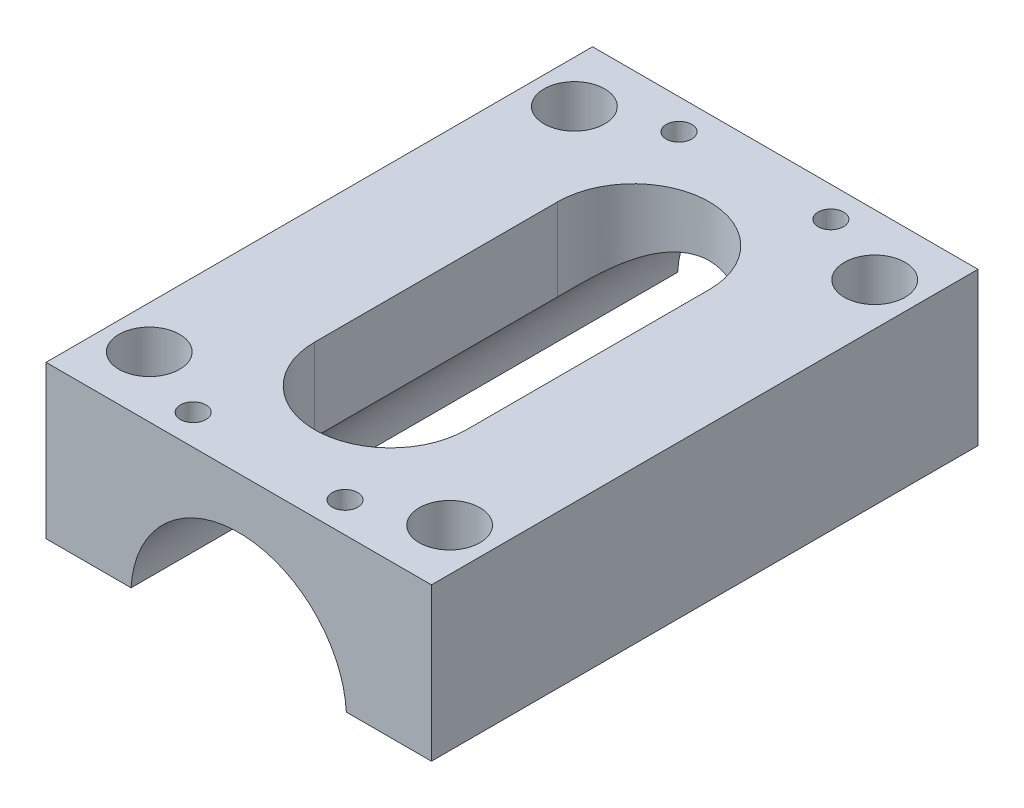
ISO-10303-21;
HEADER;
FILE_DESCRIPTION(('STEP AP214'),'2;1');
FILE_NAME('part.step','',(''),(''),'','','');
FILE_SCHEMA(('AUTOMOTIVE_DESIGN { 1 0 10303 214 1 1 1 1 }'));
ENDSEC;
DATA;
#1=APPLICATION_CONTEXT('core data for automotive mechanical design processes');
#2=APPLICATION_PROTOCOL_DEFINITION('international standard','automotive_design',2000,#1);
#3=PRODUCT_CONTEXT('',#1,'mechanical');
#4=PRODUCT('Part','Part','',(#3));
#5=PRODUCT_RELATED_PRODUCT_CATEGORY('part','',(#4));
#6=PRODUCT_DEFINITION_FORMATION('','',#4);
#7=PRODUCT_DEFINITION_CONTEXT('part definition',#1,'design');
#8=PRODUCT_DEFINITION('design','',#6,#7);
#9=PRODUCT_DEFINITION_SHAPE('','',#8);
#10=(LENGTH_UNIT() NAMED_UNIT(*) SI_UNIT(.MILLI.,.METRE.));
#11=(NAMED_UNIT(*) PLANE_ANGLE_UNIT() SI_UNIT($,.RADIAN.));
#12=(NAMED_UNIT(*) SI_UNIT($,.STERADIAN.) SOLID_ANGLE_UNIT());
#13=UNCERTAINTY_MEASURE_WITH_UNIT(LENGTH_MEASURE(1.E-05),#10,'distance_accuracy_value','');
#14=(GEOMETRIC_REPRESENTATION_CONTEXT(3) GLOBAL_UNCERTAINTY_ASSIGNED_CONTEXT((#13)) GLOBAL_UNIT_ASSIGNED_CONTEXT((#10,
#11,#12)) REPRESENTATION_CONTEXT('',''));
#15=CARTESIAN_POINT('',(0.,0.,0.));
#16=DIRECTION('',(0.,0.,1.));
#17=DIRECTION('',(1.,0.,0.));
#18=AXIS2_PLACEMENT_3D('',#15,#16,#17);
#19=CARTESIAN_POINT('',(-31.734248061046,1.,90.));
#20=DIRECTION('',(0.,1.,0.));
#21=DIRECTION('',(0.,0.,1.));
#22=AXIS2_PLACEMENT_3D('',#19,#20,#21);
#23=PLANE('',#22);
#24=CARTESIAN_POINT('',(-24.7280283297466,1.,10.));
#25=DIRECTION('',(0.,-1.,0.));
#26=DIRECTION('',(0.,0.,-1.));
#27=AXIS2_PLACEMENT_3D('',#24,#25,#26);
#28=CIRCLE('',#27,2.5);
#29=CARTESIAN_POINT('',(-24.7280283297466,1.,7.5));
#30=VERTEX_POINT('',#29);
#31=EDGE_CURVE('E401',#30,#30,#28,.T.);
#32=ORIENTED_EDGE('',*,*,#31,.F.);
#33=EDGE_LOOP('',(#32));
#34=FACE_BOUND('',#33,.T.);
#35=DIRECTION('',(1.,0.,0.));
#36=VECTOR('',#35,1.);
#37=CARTESIAN_POINT('',(-31.734248061046,1.,0.));
#38=LINE('',#37,#36);
#39=CARTESIAN_POINT('',(-31.734248061046,1.,0.));
#40=VERTEX_POINT('',#39);
#41=CARTESIAN_POINT('',(-17.7218085984473,0.999999999999997,0.));
#42=VERTEX_POINT('',#41);
#43=EDGE_CURVE('E321',#40,#42,#38,.T.);
#44=ORIENTED_EDGE('',*,*,#43,.T.);
#45=DIRECTION('',(0.,0.,-1.));
#46=VECTOR('',#45,1.);
#47=CARTESIAN_POINT('',(-17.7218085984473,0.999999999999997,90.));
#48=LINE('',#47,#46);
#49=CARTESIAN_POINT('',(-17.7218085984473,0.999999999999997,90.));
#50=VERTEX_POINT('',#49);
#51=EDGE_CURVE('E67',#50,#42,#48,.T.);
#52=ORIENTED_EDGE('',*,*,#51,.F.);
#53=DIRECTION('',(1.,0.,0.));
#54=VECTOR('',#53,1.);
#55=CARTESIAN_POINT('',(-31.734248061046,1.,90.));
#56=LINE('',#55,#54);
#57=CARTESIAN_POINT('',(-31.734248061046,1.,90.));
#58=VERTEX_POINT('',#57);
#59=EDGE_CURVE('E334',#58,#50,#56,.T.);
#60=ORIENTED_EDGE('',*,*,#59,.F.);
#61=DIRECTION('',(0.,0.,-1.));
#62=VECTOR('',#61,1.);
#63=CARTESIAN_POINT('',(-31.734248061046,1.,90.));
#64=LINE('',#63,#62);
#65=EDGE_CURVE('E12',#58,#40,#64,.T.);
#66=ORIENTED_EDGE('',*,*,#65,.T.);
#67=EDGE_LOOP('',(#44,#52,#60,#66));
#68=FACE_BOUND('',#67,.T.);
#69=CARTESIAN_POINT('',(-24.7280283297466,1.,80.));
#70=DIRECTION('',(0.,-1.,0.));
#71=DIRECTION('',(0.,0.,-1.));
#72=AXIS2_PLACEMENT_3D('',#69,#70,#71);
#73=CIRCLE('',#72,2.5);
#74=CARTESIAN_POINT('',(-24.7280283297466,1.,77.5));
#75=VERTEX_POINT('',#74);
#76=EDGE_CURVE('E398',#75,#75,#73,.T.);
#77=ORIENTED_EDGE('',*,*,#76,.F.);
#78=EDGE_LOOP('',(#77));
#79=FACE_BOUND('',#78,.T.);
#80=ADVANCED_FACE('F59',(#34,#68,#79),#23,.F.);
#81=CARTESIAN_POINT('',(0.,0.,90.));
#82=DIRECTION('',(0.,0.,-1.));
#83=DIRECTION('',(-1.,0.,0.));
#84=AXIS2_PLACEMENT_3D('',#81,#82,#83);
#85=CYLINDRICAL_SURFACE('',#84,17.75);
#86=DIRECTION('',(0.,0.,-1.));
#87=VECTOR('',#86,1.);
#88=CARTESIAN_POINT('',(12.5,12.6020831611286,90.));
#89=LINE('',#88,#87);
#90=CARTESIAN_POINT('',(12.5,12.6020831611286,25.));
#91=VERTEX_POINT('',#90);
#92=CARTESIAN_POINT('',(12.5,12.6020831611286,65.));
#93=VERTEX_POINT('',#92);
#94=EDGE_CURVE('E308',#91,#93,#89,.F.);
#95=ORIENTED_EDGE('',*,*,#94,.F.);
#96=CARTESIAN_POINT('',(-12.5,12.6020831611286,25.));
#97=CARTESIAN_POINT('',(-12.5000028339154,12.6020746389274,24.8491115809428));
#98=CARTESIAN_POINT('',(-12.4972670789548,12.6047945701414,24.6982503162762));
#99=CARTESIAN_POINT('',(-12.4863537975247,12.61560764559,24.3969359446047));
#100=CARTESIAN_POINT('',(-12.4781769481296,12.6237001212803,24.2464827891545));
#101=CARTESIAN_POINT('',(-12.4455777232016,12.6558715266399,23.7967739301851));
#102=CARTESIAN_POINT('',(-12.4130863798533,12.687845066378,23.4985992286537));
#103=CARTESIAN_POINT('',(-12.3278081406473,12.7707122358189,22.9113941783297));
#104=CARTESIAN_POINT('',(-12.2752505457002,12.8213918971674,22.6222990632822));
#105=CARTESIAN_POINT('',(-12.1508323661772,12.9393626253403,22.0516823867227));
#106=CARTESIAN_POINT('',(-12.0789648031872,13.0066596968041,21.7701636037595));
#107=CARTESIAN_POINT('',(-11.9175751692122,13.1546871742176,21.2179841220977));
#108=CARTESIAN_POINT('',(-11.8281679456945,13.235329685367,20.9472658875278));
#109=CARTESIAN_POINT('',(-11.6324699793027,13.4076519080734,20.4156936382005));
#110=CARTESIAN_POINT('',(-11.5261803883721,13.4993308664714,20.1548389519208));
#111=CARTESIAN_POINT('',(-11.297277223378,13.6914724097666,19.6427209766633));
#112=CARTESIAN_POINT('',(-11.1746152333951,13.7919607306676,19.3914890946909));
#113=CARTESIAN_POINT('',(-10.9139559468112,13.9991353833763,18.8997525074028));
#114=CARTESIAN_POINT('',(-10.7759564707944,14.1058225949994,18.6592493334297));
#115=CARTESIAN_POINT('',(-10.4595829262789,14.3424266489918,18.1477888017447));
#116=CARTESIAN_POINT('',(-10.2783801926229,14.4731226505208,17.8789383942353));
#117=CARTESIAN_POINT('',(-9.89632526180166,14.7369999071883,17.3568731814093));
#118=CARTESIAN_POINT('',(-9.6954716249906,14.8701813438332,17.1036595238775));
#119=CARTESIAN_POINT('',(-9.27457705897201,15.1362721776798,16.6133047352128));
#120=CARTESIAN_POINT('',(-9.05452705291189,15.2691814154416,16.3761713027086));
#121=CARTESIAN_POINT('',(-8.59580050147127,15.5320513070787,15.9188594167782));
#122=CARTESIAN_POINT('',(-8.35712265640927,15.6620117543962,15.6986821485324));
#123=CARTESIAN_POINT('',(-7.81944416924676,15.9381610345998,15.2403171188236));
#124=CARTESIAN_POINT('',(-7.51708921162151,16.0833491208002,15.0054382504416));
#125=CARTESIAN_POINT('',(-6.88847960127637,16.3624454785038,14.5622445248512));
#126=CARTESIAN_POINT('',(-6.56222047227989,16.496351627215,14.353934663054));
#127=CARTESIAN_POINT('',(-5.88781200273158,16.7488990364195,13.9666582473138));
#128=CARTESIAN_POINT('',(-5.53969673358094,16.8675632190535,13.787647517002));
#129=CARTESIAN_POINT('',(-4.82335027303136,17.0861885160032,13.4613688366644));
#130=CARTESIAN_POINT('',(-4.45512808047134,17.1861579099442,13.3140868300767));
#131=CARTESIAN_POINT('',(-3.80414937844412,17.3398517622609,13.089387281807));
#132=CARTESIAN_POINT('',(-3.52538426931816,17.398759025145,13.0038627173074));
#133=CARTESIAN_POINT('',(-2.96031795243664,17.5037575992699,12.852076590409));
#134=CARTESIAN_POINT('',(-2.67401836890562,17.5498516483096,12.7858109128262));
#135=CARTESIAN_POINT('',(-2.0958166500395,17.6282477026815,12.6734337210887));
#136=CARTESIAN_POINT('',(-1.80391824106091,17.6605585699941,12.6273092565658));
#137=CARTESIAN_POINT('',(-1.2163392669975,17.7107298513297,12.5558004349258));
#138=CARTESIAN_POINT('',(-0.920658573225944,17.7285897723447,12.5304167854013));
#139=CARTESIAN_POINT('',(-0.327116712337425,17.749474678557,12.5007414876496));
#140=CARTESIAN_POINT('',(-0.0292523562579923,17.7524697614921,12.4964923537959));
#141=CARTESIAN_POINT('',(0.565789817364994,17.7434754654324,12.5092657582647));
#142=CARTESIAN_POINT('',(0.86296763748399,17.7314861427411,12.5262882166596));
#143=CARTESIAN_POINT('',(1.45446381947151,17.6927924171469,12.5813532878807));
#144=CARTESIAN_POINT('',(1.74878149483333,17.6660845660718,12.6194008263474));
#145=CARTESIAN_POINT('',(2.33238056332611,17.5985452527027,12.7159662703409));
#146=CARTESIAN_POINT('',(2.62166195544371,17.557713787567,12.7744841799867));
#147=CARTESIAN_POINT('',(3.186470442875,17.4639315909855,12.9095612517079));
#148=CARTESIAN_POINT('',(3.46216102768179,17.4112933381362,12.9856565352162));
#149=CARTESIAN_POINT('',(4.00542822540127,17.2943994333246,13.1556949123817));
#150=CARTESIAN_POINT('',(4.27300502310016,17.2301440461673,13.2496375992216));
#151=CARTESIAN_POINT('',(4.79877655155266,17.0911726398382,13.4543803636775));
#152=CARTESIAN_POINT('',(5.05697214008251,17.0164575800996,13.56517889524));
#153=CARTESIAN_POINT('',(5.56309622167352,16.8577826034256,13.8026725542841));
#154=CARTESIAN_POINT('',(5.81102095626205,16.7738193426545,13.9293734338401));
#155=CARTESIAN_POINT('',(6.3228101019385,16.5881495834104,14.2126508971003));
#156=CARTESIAN_POINT('',(6.58536356912699,16.4855087163775,14.370983687089));
#157=CARTESIAN_POINT('',(7.09600881246031,16.2722392188065,14.7048663949519));
#158=CARTESIAN_POINT('',(7.34409432645068,16.1616071751538,14.8804236811949));
#159=CARTESIAN_POINT('',(7.82532403288037,15.9341674181209,15.2477684808738));
#160=CARTESIAN_POINT('',(8.05845467773714,15.817354275314,15.4395703552987));
#161=CARTESIAN_POINT('',(8.50901164829316,15.5796051242141,15.8382754006691));
#162=CARTESIAN_POINT('',(8.726442319591,15.4586702705181,16.0451743607643));
#163=CARTESIAN_POINT('',(9.18311877665418,15.1925862405816,16.512046398157));
#164=CARTESIAN_POINT('',(9.4192192026366,15.0470061383688,16.7748588989846));
#165=CARTESIAN_POINT('',(9.86850887617469,14.756241093611,17.3196846294302));
#166=CARTESIAN_POINT('',(10.0816933711716,14.6110562390985,17.6017018221954));
#167=CARTESIAN_POINT('',(10.4843560811418,14.3248662435936,18.184304722987));
#168=CARTESIAN_POINT('',(10.673829344452,14.1838619803181,18.4848942900067));
#169=CARTESIAN_POINT('',(11.0278945964214,13.910357674617,19.1040147818757));
#170=CARTESIAN_POINT('',(11.1924943658501,13.7778549802782,19.422540053217));
#171=CARTESIAN_POINT('',(11.460621569738,13.5550621139153,20.0018663349969));
#172=CARTESIAN_POINT('',(11.5694984441117,13.4620594525255,20.2591557006044));
#173=CARTESIAN_POINT('',(11.7707616449666,13.2864406732411,20.783598128025));
#174=CARTESIAN_POINT('',(11.8631480648452,13.2038244965211,21.0507511339628));
#175=CARTESIAN_POINT('',(12.0301266066103,13.0518687043933,21.5932019188244));
#176=CARTESIAN_POINT('',(12.104779586803,12.9824838478283,21.8684680876994));
#177=CARTESIAN_POINT('',(12.2356065312731,12.8592576502227,22.4266564871443));
#178=CARTESIAN_POINT('',(12.2917882678387,12.8054097727376,22.7095754432164));
#179=CARTESIAN_POINT('',(12.391519912377,12.7089864737009,23.3235539848457));
#180=CARTESIAN_POINT('',(12.4320034477662,12.6692274830362,23.6555820959273));
#181=CARTESIAN_POINT('',(12.472697549302,12.6291185974622,24.1572765061852));
#182=CARTESIAN_POINT('',(12.4829239734786,12.6190033690316,24.3254481742661));
#183=CARTESIAN_POINT('',(12.4965785824733,12.6054778360731,24.6623996296319));
#184=CARTESIAN_POINT('',(12.5000041733327,12.6020700899026,24.8311796243635));
#185=CARTESIAN_POINT('',(12.5,12.6020831611286,25.));
#186=B_SPLINE_CURVE_WITH_KNOTS('',3,(#96,#97,#98,#99,#100,#101,#102,#103,#104,#105,#106,#107,
#108,#109,#110,#111,#112,#113,#114,#115,#116,#117,#118,#119,#120,#121,#122,#123,#124,#125,#126,
#127,#128,#129,#130,#131,#132,#133,#134,#135,#136,#137,#138,#139,#140,#141,#142,#143,#144,#145,
#146,#147,#148,#149,#150,#151,#152,#153,#154,#155,#156,#157,#158,#159,#160,#161,#162,#163,#164,
#165,#166,#167,#168,#169,#170,#171,#172,#173,#174,#175,#176,#177,#178,#179,#180,#181,#182,#183,
#184,#185),.UNSPECIFIED.,.F.,.F.,(4,2,2,2,2,2,2,2,2,2,2,2,2,2,2,2,2,2,2,2,2,2,2,2,2,2,2,2,2,2,2,
2,2,2,2,2,2,2,2,2,2,2,2,2,4),(0.,0.45256318573837,0.905070066340567,1.80838293431607,
2.70166829796942,3.59527692054128,4.48321866253245,5.3710998431349,6.26166734483381,
7.15236155597986,8.20009790140254,9.24791106265063,10.2962223877977,11.3446069200925,
12.5713560546457,13.7983354993258,15.0234475496472,16.2480157255916,17.1395491805926,
18.0308919949768,18.9216608481205,19.8124600894201,20.7050505474403,21.5976376515803,
22.490433954845,23.3832304377496,24.2547205086422,25.1261907169887,25.9975810403961,
26.8692874696792,27.8383209795954,28.8077708493913,29.7780868882767,30.7481333154208,
31.8932567306082,33.0386171777897,34.1842164151108,35.3294565481656,36.2120900069784,
37.0947184666465,37.9742726525214,38.8534562664931,39.8617429771723,40.3678638937505,
40.8741778167946),.UNSPECIFIED.);
#187=CARTESIAN_POINT('',(-12.5,12.6020831611286,25.));
#188=VERTEX_POINT('',#187);
#189=EDGE_CURVE('E74',#188,#91,#186,.T.);
#190=ORIENTED_EDGE('',*,*,#189,.F.);
#191=DIRECTION('',(0.,0.,-1.));
#192=VECTOR('',#191,1.);
#193=CARTESIAN_POINT('',(-12.5,12.6020831611286,90.));
#194=LINE('',#193,#192);
#195=CARTESIAN_POINT('',(-12.5,12.6020831611286,65.));
#196=VERTEX_POINT('',#195);
#197=EDGE_CURVE('E200',#196,#188,#194,.T.);
#198=ORIENTED_EDGE('',*,*,#197,.F.);
#199=CARTESIAN_POINT('',(12.5,12.6020831611285,65.));
#200=CARTESIAN_POINT('',(12.5000028339154,12.6020746389274,65.1508884190572));
#201=CARTESIAN_POINT('',(12.4972670789548,12.6047945701414,65.3017496837238));
#202=CARTESIAN_POINT('',(12.4863537975248,12.61560764559,65.6030640553953));
#203=CARTESIAN_POINT('',(12.4781769481296,12.6237001212803,65.7535172108454));
#204=CARTESIAN_POINT('',(12.4455777232017,12.6558715266399,66.2032260698149));
#205=CARTESIAN_POINT('',(12.4130863798533,12.687845066378,66.5014007713463));
#206=CARTESIAN_POINT('',(12.3278081406474,12.7707122358189,67.0886058216703));
#207=CARTESIAN_POINT('',(12.2752505457002,12.8213918971674,67.3777009367178));
#208=CARTESIAN_POINT('',(12.1508323661773,12.9393626253403,67.9483176132773));
#209=CARTESIAN_POINT('',(12.0789648031872,13.0066596968041,68.2298363962405));
#210=CARTESIAN_POINT('',(11.9175751692122,13.1546871742176,68.7820158779023));
#211=CARTESIAN_POINT('',(11.8281679456945,13.235329685367,69.0527341124722));
#212=CARTESIAN_POINT('',(11.6324699793027,13.4076519080734,69.5843063617996));
#213=CARTESIAN_POINT('',(11.5261803883721,13.4993308664714,69.8451610480792));
#214=CARTESIAN_POINT('',(11.297277223378,13.6914724097666,70.3572790233367));
#215=CARTESIAN_POINT('',(11.1746152333951,13.7919607306676,70.6085109053091));
#216=CARTESIAN_POINT('',(10.9139559468112,13.9991353833763,71.1002474925972));
#217=CARTESIAN_POINT('',(10.7759564707944,14.1058225949994,71.3407506665703));
#218=CARTESIAN_POINT('',(10.4595829262789,14.3424266489918,71.8522111982554));
#219=CARTESIAN_POINT('',(10.2783801926229,14.4731226505208,72.1210616057647));
#220=CARTESIAN_POINT('',(9.89632526180166,14.7369999071883,72.6431268185907));
#221=CARTESIAN_POINT('',(9.6954716249906,14.8701813438332,72.8963404761225));
#222=CARTESIAN_POINT('',(9.27457705897201,15.1362721776798,73.3866952647872));
#223=CARTESIAN_POINT('',(9.05452705291189,15.2691814154416,73.6238286972914));
#224=CARTESIAN_POINT('',(8.59580050147128,15.5320513070787,74.0811405832218));
#225=CARTESIAN_POINT('',(8.35712265640927,15.6620117543962,74.3013178514676));
#226=CARTESIAN_POINT('',(7.81944416924676,15.9381610345998,74.7596828811764));
#227=CARTESIAN_POINT('',(7.5170892116215,16.0833491208002,74.9945617495584));
#228=CARTESIAN_POINT('',(6.88847960127636,16.3624454785038,75.4377554751488));
#229=CARTESIAN_POINT('',(6.56222047227988,16.496351627215,75.646065336946));
#230=CARTESIAN_POINT('',(5.88781200273157,16.7488990364195,76.0333417526862));
#231=CARTESIAN_POINT('',(5.53969673358093,16.8675632190535,76.212352482998));
#232=CARTESIAN_POINT('',(4.82335027303135,17.0861885160033,76.5386311633357));
#233=CARTESIAN_POINT('',(4.45512808047132,17.1861579099442,76.6859131699233));
#234=CARTESIAN_POINT('',(3.8041493784441,17.3398517622609,76.910612718193));
#235=CARTESIAN_POINT('',(3.52538426931814,17.398759025145,76.9961372826926));
#236=CARTESIAN_POINT('',(2.96031795243663,17.5037575992699,77.147923409591));
#237=CARTESIAN_POINT('',(2.6740183689056,17.5498516483096,77.2141890871738));
#238=CARTESIAN_POINT('',(2.09581665003949,17.6282477026815,77.3265662789113));
#239=CARTESIAN_POINT('',(1.80391824106089,17.6605585699941,77.3726907434342));
#240=CARTESIAN_POINT('',(1.21633926699748,17.7107298513297,77.4441995650742));
#241=CARTESIAN_POINT('',(0.920658573225926,17.7285897723447,77.4695832145987));
#242=CARTESIAN_POINT('',(0.327116712337407,17.749474678557,77.4992585123504));
#243=CARTESIAN_POINT('',(0.0292523562579743,17.7524697614921,77.5035076462041));
#244=CARTESIAN_POINT('',(-0.565789817365012,17.7434754654324,77.4907342417353));
#245=CARTESIAN_POINT('',(-0.862967637484007,17.7314861427411,77.4737117833403));
#246=CARTESIAN_POINT('',(-1.45446381947153,17.6927924171469,77.4186467121193));
#247=CARTESIAN_POINT('',(-1.74878149483335,17.6660845660718,77.3805991736526));
#248=CARTESIAN_POINT('',(-2.33238056332613,17.5985452527027,77.2840337296591));
#249=CARTESIAN_POINT('',(-2.62166195544372,17.557713787567,77.2255158200133));
#250=CARTESIAN_POINT('',(-3.18647044287502,17.4639315909855,77.0904387482921));
#251=CARTESIAN_POINT('',(-3.46216102768181,17.4112933381362,77.0143434647838));
#252=CARTESIAN_POINT('',(-4.00542822540129,17.2943994333246,76.8443050876183));
#253=CARTESIAN_POINT('',(-4.27300502310017,17.2301440461673,76.7503624007784));
#254=CARTESIAN_POINT('',(-4.79877655155268,17.0911726398382,76.5456196363225));
#255=CARTESIAN_POINT('',(-5.05697214008253,17.0164575800996,76.4348211047599));
#256=CARTESIAN_POINT('',(-5.56309622167353,16.8577826034256,76.1973274457159));
#257=CARTESIAN_POINT('',(-5.81102095626206,16.7738193426545,76.0706265661599));
#258=CARTESIAN_POINT('',(-6.32281010193851,16.5881495834104,75.7873491028996));
#259=CARTESIAN_POINT('',(-6.585363569127,16.4855087163775,75.629016312911));
#260=CARTESIAN_POINT('',(-7.09600881246032,16.2722392188065,75.2951336050481));
#261=CARTESIAN_POINT('',(-7.34409432645069,16.1616071751538,75.1195763188051));
#262=CARTESIAN_POINT('',(-7.82532403288038,15.9341674181209,74.7522315191262));
#263=CARTESIAN_POINT('',(-8.05845467773715,15.817354275314,74.5604296447013));
#264=CARTESIAN_POINT('',(-8.50901164829317,15.5796051242141,74.1617245993309));
#265=CARTESIAN_POINT('',(-8.72644231959101,15.4586702705181,73.9548256392356));
#266=CARTESIAN_POINT('',(-9.18311877665418,15.1925862405816,73.4879536018429));
#267=CARTESIAN_POINT('',(-9.41921920263661,15.0470061383688,73.2251411010154));
#268=CARTESIAN_POINT('',(-9.8685088761747,14.7562410936109,72.6803153705697));
#269=CARTESIAN_POINT('',(-10.0816933711716,14.6110562390985,72.3982981778045));
#270=CARTESIAN_POINT('',(-10.4843560811418,14.3248662435936,71.815695277013));
#271=CARTESIAN_POINT('',(-10.673829344452,14.1838619803181,71.5151057099933));
#272=CARTESIAN_POINT('',(-11.0278945964214,13.910357674617,70.8959852181243));
#273=CARTESIAN_POINT('',(-11.1924943658501,13.7778549802782,70.577459946783));
#274=CARTESIAN_POINT('',(-11.460621569738,13.5550621139153,69.9981336650031));
#275=CARTESIAN_POINT('',(-11.5694984441117,13.4620594525256,69.7408442993956));
#276=CARTESIAN_POINT('',(-11.7707616449666,13.2864406732411,69.216401871975));
#277=CARTESIAN_POINT('',(-11.8631480648452,13.2038244965211,68.9492488660372));
#278=CARTESIAN_POINT('',(-12.0301266066103,13.0518687043933,68.4067980811756));
#279=CARTESIAN_POINT('',(-12.104779586803,12.9824838478283,68.1315319123006));
#280=CARTESIAN_POINT('',(-12.2356065312731,12.8592576502227,67.5733435128557));
#281=CARTESIAN_POINT('',(-12.2917882678387,12.8054097727376,67.2904245567835));
#282=CARTESIAN_POINT('',(-12.391519912377,12.7089864737009,66.6764460151542));
#283=CARTESIAN_POINT('',(-12.4320034477662,12.6692274830363,66.3444179040727));
#284=CARTESIAN_POINT('',(-12.472697549302,12.6291185974622,65.8427234938147));
#285=CARTESIAN_POINT('',(-12.4829239734786,12.6190033690316,65.6745518257339));
#286=CARTESIAN_POINT('',(-12.4965785824733,12.6054778360731,65.3376003703682));
#287=CARTESIAN_POINT('',(-12.5000041733327,12.6020700899026,65.1688203756365));
#288=CARTESIAN_POINT('',(-12.5,12.6020831611286,65.));
#289=B_SPLINE_CURVE_WITH_KNOTS('',3,(#199,#200,#201,#202,#203,#204,#205,#206,#207,#208,#209,
#210,#211,#212,#213,#214,#215,#216,#217,#218,#219,#220,#221,#222,#223,#224,#225,#226,#227,#228,
#229,#230,#231,#232,#233,#234,#235,#236,#237,#238,#239,#240,#241,#242,#243,#244,#245,#246,#247,
#248,#249,#250,#251,#252,#253,#254,#255,#256,#257,#258,#259,#260,#261,#262,#263,#264,#265,#266,
#267,#268,#269,#270,#271,#272,#273,#274,#275,#276,#277,#278,#279,#280,#281,#282,#283,#284,#285,
#286,#287,#288),.UNSPECIFIED.,.F.,.F.,(4,2,2,2,2,2,2,2,2,2,2,2,2,2,2,2,2,2,2,2,2,2,2,2,2,2,2,2,
2,2,2,2,2,2,2,2,2,2,2,2,2,2,2,2,4),(0.,0.45256318573837,0.90507006634056,1.80838293431606,
2.7016682979694,3.59527692054128,4.48321866253247,5.37109984313491,6.26166734483382,
7.15236155597988,8.20009790140255,9.24791106265065,10.2962223877977,11.3446069200925,
12.5713560546457,13.7983354993258,15.0234475496472,16.2480157255916,17.1395491805926,
18.0308919949768,18.9216608481205,19.8124600894202,20.7050505474403,21.5976376515804,
22.490433954845,23.3832304377496,24.2547205086423,25.1261907169887,25.9975810403961,
26.8692874696792,27.8383209795954,28.8077708493913,29.7780868882767,30.7481333154208,
31.8932567306082,33.0386171777897,34.1842164151108,35.3294565481656,36.2120900069784,
37.0947184666465,37.9742726525214,38.8534562664931,39.8617429771723,40.3678638937505,
40.8741778167946),.UNSPECIFIED.);
#290=EDGE_CURVE('E191',#93,#196,#289,.T.);
#291=ORIENTED_EDGE('',*,*,#290,.F.);
#292=EDGE_LOOP('',(#95,#190,#198,#291));
#293=FACE_BOUND('',#292,.T.);
#294=CARTESIAN_POINT('',(0.,0.,0.));
#295=DIRECTION('',(0.,0.,-1.));
#296=DIRECTION('',(1.,0.,0.));
#297=AXIS2_PLACEMENT_3D('',#294,#295,#296);
#298=CIRCLE('',#297,17.75);
#299=CARTESIAN_POINT('',(17.7218085984473,1.,0.));
#300=VERTEX_POINT('',#299);
#301=EDGE_CURVE('E312',#42,#300,#298,.T.);
#302=ORIENTED_EDGE('',*,*,#301,.T.);
#303=DIRECTION('',(0.,0.,-1.));
#304=VECTOR('',#303,1.);
#305=CARTESIAN_POINT('',(17.7218085984473,1.,90.));
#306=LINE('',#305,#304);
#307=CARTESIAN_POINT('',(17.7218085984473,1.,90.));
#308=VERTEX_POINT('',#307);
#309=EDGE_CURVE('E315',#308,#300,#306,.T.);
#310=ORIENTED_EDGE('',*,*,#309,.F.);
#311=CARTESIAN_POINT('',(0.,0.,90.));
#312=DIRECTION('',(0.,0.,-1.));
#313=DIRECTION('',(1.,0.,0.));
#314=AXIS2_PLACEMENT_3D('',#311,#312,#313);
#315=CIRCLE('',#314,17.75);
#316=EDGE_CURVE('E336',#50,#308,#315,.T.);
#317=ORIENTED_EDGE('',*,*,#316,.F.);
#318=ORIENTED_EDGE('',*,*,#51,.T.);
#319=EDGE_LOOP('',(#302,#310,#317,#318));
#320=FACE_BOUND('',#319,.T.);
#321=ADVANCED_FACE('F296',(#293,#320),#85,.F.);
#322=CARTESIAN_POINT('',(17.7218085984473,1.,90.));
#323=DIRECTION('',(0.,1.,0.));
#324=DIRECTION('',(0.,0.,1.));
#325=AXIS2_PLACEMENT_3D('',#322,#323,#324);
#326=PLANE('',#325);
#327=CARTESIAN_POINT('',(24.7280283297466,1.,80.));
#328=DIRECTION('',(0.,-1.,0.));
#329=DIRECTION('',(0.,0.,-1.));
#330=AXIS2_PLACEMENT_3D('',#327,#328,#329);
#331=CIRCLE('',#330,2.5);
#332=CARTESIAN_POINT('',(24.7280283297466,1.,77.5));
#333=VERTEX_POINT('',#332);
#334=EDGE_CURVE('E404',#333,#333,#331,.T.);
#335=ORIENTED_EDGE('',*,*,#334,.F.);
#336=EDGE_LOOP('',(#335));
#337=FACE_BOUND('',#336,.T.);
#338=CARTESIAN_POINT('',(24.7280283297466,1.,10.0000000000001));
#339=DIRECTION('',(0.,-1.,0.));
#340=DIRECTION('',(0.,0.,-1.));
#341=AXIS2_PLACEMENT_3D('',#338,#339,#340);
#342=CIRCLE('',#341,2.5);
#343=CARTESIAN_POINT('',(24.7280283297466,1.,7.50000000000006));
#344=VERTEX_POINT('',#343);
#345=EDGE_CURVE('E407',#344,#344,#342,.T.);
#346=ORIENTED_EDGE('',*,*,#345,.F.);
#347=EDGE_LOOP('',(#346));
#348=FACE_BOUND('',#347,.T.);
#349=DIRECTION('',(1.,0.,0.));
#350=VECTOR('',#349,1.);
#351=CARTESIAN_POINT('',(17.7218085984473,1.,0.));
#352=LINE('',#351,#350);
#353=CARTESIAN_POINT('',(31.734248061046,1.,0.));
#354=VERTEX_POINT('',#353);
#355=EDGE_CURVE('E320',#300,#354,#352,.T.);
#356=ORIENTED_EDGE('',*,*,#355,.T.);
#357=DIRECTION('',(0.,0.,-1.));
#358=VECTOR('',#357,1.);
#359=CARTESIAN_POINT('',(31.734248061046,1.,90.));
#360=LINE('',#359,#358);
#361=CARTESIAN_POINT('',(31.734248061046,1.,90.));
#362=VERTEX_POINT('',#361);
#363=EDGE_CURVE('E328',#362,#354,#360,.T.);
#364=ORIENTED_EDGE('',*,*,#363,.F.);
#365=DIRECTION('',(1.,0.,0.));
#366=VECTOR('',#365,1.);
#367=CARTESIAN_POINT('',(17.7218085984473,1.,90.));
#368=LINE('',#367,#366);
#369=EDGE_CURVE('E327',#308,#362,#368,.T.);
#370=ORIENTED_EDGE('',*,*,#369,.F.);
#371=ORIENTED_EDGE('',*,*,#309,.T.);
#372=EDGE_LOOP('',(#356,#364,#370,#371));
#373=FACE_BOUND('',#372,.T.);
#374=ADVANCED_FACE('F290',(#337,#348,#373),#326,.F.);
#375=CARTESIAN_POINT('',(0.,0.,90.));
#376=DIRECTION('',(0.,0.,1.));
#377=DIRECTION('',(1.,0.,0.));
#378=AXIS2_PLACEMENT_3D('',#375,#376,#377);
#379=PLANE('',#378);
#380=DIRECTION('',(1.,0.,0.));
#381=VECTOR('',#380,1.);
#382=CARTESIAN_POINT('',(0.,26.154588507564,90.));
#383=LINE('',#382,#381);
#384=CARTESIAN_POINT('',(-31.734248061046,26.154588507564,90.));
#385=VERTEX_POINT('',#384);
#386=CARTESIAN_POINT('',(31.734248061046,26.154588507564,90.));
#387=VERTEX_POINT('',#386);
#388=EDGE_CURVE('E346',#385,#387,#383,.T.);
#389=ORIENTED_EDGE('',*,*,#388,.F.);
#390=DIRECTION('',(0.,1.,0.));
#391=VECTOR('',#390,1.);
#392=CARTESIAN_POINT('',(-31.734248061046,0.,90.));
#393=LINE('',#392,#391);
#394=EDGE_CURVE('E412',#58,#385,#393,.T.);
#395=ORIENTED_EDGE('',*,*,#394,.F.);
#396=ORIENTED_EDGE('',*,*,#59,.T.);
#397=ORIENTED_EDGE('',*,*,#316,.T.);
#398=ORIENTED_EDGE('',*,*,#369,.T.);
#399=DIRECTION('',(0.,1.,0.));
#400=VECTOR('',#399,1.);
#401=CARTESIAN_POINT('',(31.734248061046,0.,90.));
#402=LINE('',#401,#400);
#403=EDGE_CURVE('E415',#362,#387,#402,.T.);
#404=ORIENTED_EDGE('',*,*,#403,.T.);
#405=EDGE_LOOP('',(#389,#395,#396,#397,#398,#404));
#406=FACE_BOUND('',#405,.T.);
#407=ADVANCED_FACE('F287',(#406),#379,.T.);
#408=CARTESIAN_POINT('',(0.,0.,0.));
#409=DIRECTION('',(0.,0.,1.));
#410=DIRECTION('',(1.,0.,0.));
#411=AXIS2_PLACEMENT_3D('',#408,#409,#410);
#412=PLANE('',#411);
#413=DIRECTION('',(0.,-1.,0.));
#414=VECTOR('',#413,1.);
#415=CARTESIAN_POINT('',(-31.734248061046,0.,0.));
#416=LINE('',#415,#414);
#417=CARTESIAN_POINT('',(-31.734248061046,26.154588507564,0.));
#418=VERTEX_POINT('',#417);
#419=EDGE_CURVE('E410',#418,#40,#416,.T.);
#420=ORIENTED_EDGE('',*,*,#419,.F.);
#421=DIRECTION('',(1.,0.,0.));
#422=VECTOR('',#421,1.);
#423=CARTESIAN_POINT('',(0.,26.154588507564,0.));
#424=LINE('',#423,#422);
#425=CARTESIAN_POINT('',(31.734248061046,26.154588507564,0.));
#426=VERTEX_POINT('',#425);
#427=EDGE_CURVE('E358',#418,#426,#424,.T.);
#428=ORIENTED_EDGE('',*,*,#427,.T.);
#429=DIRECTION('',(0.,-1.,0.));
#430=VECTOR('',#429,1.);
#431=CARTESIAN_POINT('',(31.734248061046,0.,0.));
#432=LINE('',#431,#430);
#433=EDGE_CURVE('E333',#426,#354,#432,.T.);
#434=ORIENTED_EDGE('',*,*,#433,.T.);
#435=ORIENTED_EDGE('',*,*,#355,.F.);
#436=ORIENTED_EDGE('',*,*,#301,.F.);
#437=ORIENTED_EDGE('',*,*,#43,.F.);
#438=EDGE_LOOP('',(#420,#428,#434,#435,#436,#437));
#439=FACE_BOUND('',#438,.T.);
#440=ADVANCED_FACE('F285',(#439),#412,.F.);
#441=CARTESIAN_POINT('',(31.734248061046,0.,-44.1885166078247));
#442=DIRECTION('',(1.,0.,0.));
#443=DIRECTION('',(0.,0.,-1.));
#444=AXIS2_PLACEMENT_3D('',#441,#442,#443);
#445=PLANE('',#444);
#446=DIRECTION('',(0.,0.,1.));
#447=VECTOR('',#446,1.);
#448=CARTESIAN_POINT('',(31.734248061046,26.154588507564,0.));
#449=LINE('',#448,#447);
#450=EDGE_CURVE('E360',#426,#387,#449,.T.);
#451=ORIENTED_EDGE('',*,*,#450,.T.);
#452=ORIENTED_EDGE('',*,*,#403,.F.);
#453=ORIENTED_EDGE('',*,*,#363,.T.);
#454=ORIENTED_EDGE('',*,*,#433,.F.);
#455=EDGE_LOOP('',(#451,#452,#453,#454));
#456=FACE_BOUND('',#455,.T.);
#457=ADVANCED_FACE('F281',(#456),#445,.T.);
#458=CARTESIAN_POINT('',(-31.734248061046,0.,-44.1885166078247));
#459=DIRECTION('',(1.,0.,0.));
#460=DIRECTION('',(0.,0.,-1.));
#461=AXIS2_PLACEMENT_3D('',#458,#459,#460);
#462=PLANE('',#461);
#463=ORIENTED_EDGE('',*,*,#394,.T.);
#464=DIRECTION('',(0.,0.,1.));
#465=VECTOR('',#464,1.);
#466=CARTESIAN_POINT('',(-31.734248061046,26.154588507564,0.));
#467=LINE('',#466,#465);
#468=EDGE_CURVE('E344',#418,#385,#467,.T.);
#469=ORIENTED_EDGE('',*,*,#468,.F.);
#470=ORIENTED_EDGE('',*,*,#419,.T.);
#471=ORIENTED_EDGE('',*,*,#65,.F.);
#472=EDGE_LOOP('',(#463,#469,#470,#471));
#473=FACE_BOUND('',#472,.T.);
#474=ADVANCED_FACE('F277',(#473),#462,.F.);
#475=CARTESIAN_POINT('',(24.7280283297466,1.,10.0000000000001));
#476=DIRECTION('',(0.,-1.,0.));
#477=DIRECTION('',(0.,0.,-1.));
#478=AXIS2_PLACEMENT_3D('',#475,#476,#477);
#479=CYLINDRICAL_SURFACE('',#478,2.5);
#480=CARTESIAN_POINT('',(24.7280283297466,4.,10.0000000000001));
#481=DIRECTION('',(0.,-1.,0.));
#482=DIRECTION('',(0.,0.,-1.));
#483=AXIS2_PLACEMENT_3D('',#480,#481,#482);
#484=CIRCLE('',#483,2.5);
#485=CARTESIAN_POINT('',(24.7280283297466,4.,7.50000000000006));
#486=VERTEX_POINT('',#485);
#487=EDGE_CURVE('E379',#486,#486,#484,.T.);
#488=ORIENTED_EDGE('',*,*,#487,.F.);
#489=EDGE_LOOP('',(#488));
#490=FACE_BOUND('',#489,.T.);
#491=ORIENTED_EDGE('',*,*,#345,.T.);
#492=EDGE_LOOP('',(#491));
#493=FACE_BOUND('',#492,.T.);
#494=ADVANCED_FACE('F273',(#490,#493),#479,.F.);
#495=CARTESIAN_POINT('',(24.7280283297466,1.,80.));
#496=DIRECTION('',(0.,-1.,0.));
#497=DIRECTION('',(0.,0.,-1.));
#498=AXIS2_PLACEMENT_3D('',#495,#496,#497);
#499=CYLINDRICAL_SURFACE('',#498,2.5);
#500=CARTESIAN_POINT('',(24.7280283297466,4.,80.));
#501=DIRECTION('',(0.,-1.,0.));
#502=DIRECTION('',(0.,0.,-1.));
#503=AXIS2_PLACEMENT_3D('',#500,#501,#502);
#504=CIRCLE('',#503,2.5);
#505=CARTESIAN_POINT('',(24.7280283297466,4.,77.5));
#506=VERTEX_POINT('',#505);
#507=EDGE_CURVE('E386',#506,#506,#504,.T.);
#508=ORIENTED_EDGE('',*,*,#507,.F.);
#509=EDGE_LOOP('',(#508));
#510=FACE_BOUND('',#509,.T.);
#511=ORIENTED_EDGE('',*,*,#334,.T.);
#512=EDGE_LOOP('',(#511));
#513=FACE_BOUND('',#512,.T.);
#514=ADVANCED_FACE('F269',(#510,#513),#499,.F.);
#515=CARTESIAN_POINT('',(-24.7280283297466,1.,10.));
#516=DIRECTION('',(0.,-1.,0.));
#517=DIRECTION('',(0.,0.,-1.));
#518=AXIS2_PLACEMENT_3D('',#515,#516,#517);
#519=CYLINDRICAL_SURFACE('',#518,2.5);
#520=CARTESIAN_POINT('',(-24.7280283297466,4.,10.));
#521=DIRECTION('',(0.,-1.,0.));
#522=DIRECTION('',(0.,0.,-1.));
#523=AXIS2_PLACEMENT_3D('',#520,#521,#522);
#524=CIRCLE('',#523,2.5);
#525=CARTESIAN_POINT('',(-24.7280283297466,4.,7.50000000000001));
#526=VERTEX_POINT('',#525);
#527=EDGE_CURVE('E378',#526,#526,#524,.T.);
#528=ORIENTED_EDGE('',*,*,#527,.F.);
#529=EDGE_LOOP('',(#528));
#530=FACE_BOUND('',#529,.T.);
#531=ORIENTED_EDGE('',*,*,#31,.T.);
#532=EDGE_LOOP('',(#531));
#533=FACE_BOUND('',#532,.T.);
#534=ADVANCED_FACE('F265',(#530,#533),#519,.F.);
#535=CARTESIAN_POINT('',(-24.7280283297466,1.,80.));
#536=DIRECTION('',(0.,-1.,0.));
#537=DIRECTION('',(0.,0.,-1.));
#538=AXIS2_PLACEMENT_3D('',#535,#536,#537);
#539=CYLINDRICAL_SURFACE('',#538,2.5);
#540=CARTESIAN_POINT('',(-24.7280283297466,4.,80.));
#541=DIRECTION('',(0.,-1.,0.));
#542=DIRECTION('',(0.,0.,-1.));
#543=AXIS2_PLACEMENT_3D('',#540,#541,#542);
#544=CIRCLE('',#543,2.5);
#545=CARTESIAN_POINT('',(-24.7280283297466,4.,77.5));
#546=VERTEX_POINT('',#545);
#547=EDGE_CURVE('E395',#546,#546,#544,.T.);
#548=ORIENTED_EDGE('',*,*,#547,.F.);
#549=EDGE_LOOP('',(#548));
#550=FACE_BOUND('',#549,.T.);
#551=ORIENTED_EDGE('',*,*,#76,.T.);
#552=EDGE_LOOP('',(#551));
#553=FACE_BOUND('',#552,.T.);
#554=ADVANCED_FACE('F261',(#550,#553),#539,.F.);
#555=CARTESIAN_POINT('',(-24.7280283297466,31.751,80.));
#556=DIRECTION('',(0.,-1.,0.));
#557=DIRECTION('',(0.,0.,-1.));
#558=AXIS2_PLACEMENT_3D('',#555,#556,#557);
#559=CYLINDRICAL_SURFACE('',#558,5.);
#560=CARTESIAN_POINT('',(-24.7280283297466,26.154588507564,80.));
#561=DIRECTION('',(0.,-1.,0.));
#562=DIRECTION('',(0.,0.,-1.));
#563=AXIS2_PLACEMENT_3D('',#560,#561,#562);
#564=CIRCLE('',#563,5.);
#565=CARTESIAN_POINT('',(-24.7280283297466,26.154588507564,75.));
#566=VERTEX_POINT('',#565);
#567=EDGE_CURVE('E371',#566,#566,#564,.F.);
#568=ORIENTED_EDGE('',*,*,#567,.T.);
#569=EDGE_LOOP('',(#568));
#570=FACE_BOUND('',#569,.T.);
#571=CARTESIAN_POINT('',(-24.7280283297466,4.,80.));
#572=DIRECTION('',(0.,-1.,0.));
#573=DIRECTION('',(0.,0.,-1.));
#574=AXIS2_PLACEMENT_3D('',#571,#572,#573);
#575=CIRCLE('',#574,5.);
#576=CARTESIAN_POINT('',(-24.7280283297466,4.,75.));
#577=VERTEX_POINT('',#576);
#578=EDGE_CURVE('E382',#577,#577,#575,.T.);
#579=ORIENTED_EDGE('',*,*,#578,.T.);
#580=EDGE_LOOP('',(#579));
#581=FACE_BOUND('',#580,.T.);
#582=ADVANCED_FACE('F257',(#570,#581),#559,.F.);
#583=CARTESIAN_POINT('',(-24.7280283297466,4.,80.));
#584=DIRECTION('',(0.,-1.,0.));
#585=DIRECTION('',(0.,0.,-1.));
#586=AXIS2_PLACEMENT_3D('',#583,#584,#585);
#587=PLANE('',#586);
#588=ORIENTED_EDGE('',*,*,#547,.T.);
#589=EDGE_LOOP('',(#588));
#590=FACE_BOUND('',#589,.T.);
#591=ORIENTED_EDGE('',*,*,#578,.F.);
#592=EDGE_LOOP('',(#591));
#593=FACE_BOUND('',#592,.T.);
#594=ADVANCED_FACE('F239',(#590,#593),#587,.F.);
#595=CARTESIAN_POINT('',(-24.7280283297466,31.751,10.));
#596=DIRECTION('',(0.,-1.,0.));
#597=DIRECTION('',(0.,0.,-1.));
#598=AXIS2_PLACEMENT_3D('',#595,#596,#597);
#599=CYLINDRICAL_SURFACE('',#598,5.);
#600=CARTESIAN_POINT('',(-24.7280283297466,26.154588507564,10.));
#601=DIRECTION('',(0.,-1.,0.));
#602=DIRECTION('',(0.,0.,-1.));
#603=AXIS2_PLACEMENT_3D('',#600,#601,#602);
#604=CIRCLE('',#603,5.);
#605=CARTESIAN_POINT('',(-24.7280283297466,26.154588507564,5.));
#606=VERTEX_POINT('',#605);
#607=EDGE_CURVE('E368',#606,#606,#604,.F.);
#608=ORIENTED_EDGE('',*,*,#607,.T.);
#609=EDGE_LOOP('',(#608));
#610=FACE_BOUND('',#609,.T.);
#611=CARTESIAN_POINT('',(-24.7280283297466,4.,10.));
#612=DIRECTION('',(0.,-1.,0.));
#613=DIRECTION('',(0.,0.,-1.));
#614=AXIS2_PLACEMENT_3D('',#611,#612,#613);
#615=CIRCLE('',#614,5.);
#616=CARTESIAN_POINT('',(-24.7280283297466,4.,5.));
#617=VERTEX_POINT('',#616);
#618=EDGE_CURVE('E375',#617,#617,#615,.T.);
#619=ORIENTED_EDGE('',*,*,#618,.T.);
#620=EDGE_LOOP('',(#619));
#621=FACE_BOUND('',#620,.T.);
#622=ADVANCED_FACE('F235',(#610,#621),#599,.F.);
#623=CARTESIAN_POINT('',(-24.7280283297466,4.,10.));
#624=DIRECTION('',(0.,-1.,0.));
#625=DIRECTION('',(0.,0.,-1.));
#626=AXIS2_PLACEMENT_3D('',#623,#624,#625);
#627=PLANE('',#626);
#628=ORIENTED_EDGE('',*,*,#527,.T.);
#629=EDGE_LOOP('',(#628));
#630=FACE_BOUND('',#629,.T.);
#631=ORIENTED_EDGE('',*,*,#618,.F.);
#632=EDGE_LOOP('',(#631));
#633=FACE_BOUND('',#632,.T.);
#634=ADVANCED_FACE('F231',(#630,#633),#627,.F.);
#635=CARTESIAN_POINT('',(24.7280283297466,31.751,80.));
#636=DIRECTION('',(0.,-1.,0.));
#637=DIRECTION('',(0.,0.,-1.));
#638=AXIS2_PLACEMENT_3D('',#635,#636,#637);
#639=CYLINDRICAL_SURFACE('',#638,5.);
#640=CARTESIAN_POINT('',(24.7280283297466,26.154588507564,80.));
#641=DIRECTION('',(0.,-1.,0.));
#642=DIRECTION('',(0.,0.,-1.));
#643=AXIS2_PLACEMENT_3D('',#640,#641,#642);
#644=CIRCLE('',#643,5.);
#645=CARTESIAN_POINT('',(24.7280283297466,26.154588507564,75.));
#646=VERTEX_POINT('',#645);
#647=EDGE_CURVE('E365',#646,#646,#644,.F.);
#648=ORIENTED_EDGE('',*,*,#647,.T.);
#649=EDGE_LOOP('',(#648));
#650=FACE_BOUND('',#649,.T.);
#651=CARTESIAN_POINT('',(24.7280283297466,4.,80.));
#652=DIRECTION('',(0.,-1.,0.));
#653=DIRECTION('',(0.,0.,-1.));
#654=AXIS2_PLACEMENT_3D('',#651,#652,#653);
#655=CIRCLE('',#654,5.);
#656=CARTESIAN_POINT('',(24.7280283297466,4.,75.));
#657=VERTEX_POINT('',#656);
#658=EDGE_CURVE('E374',#657,#657,#655,.T.);
#659=ORIENTED_EDGE('',*,*,#658,.T.);
#660=EDGE_LOOP('',(#659));
#661=FACE_BOUND('',#660,.T.);
#662=ADVANCED_FACE('F234',(#650,#661),#639,.F.);
#663=CARTESIAN_POINT('',(24.7280283297466,4.,80.));
#664=DIRECTION('',(0.,-1.,0.));
#665=DIRECTION('',(0.,0.,-1.));
#666=AXIS2_PLACEMENT_3D('',#663,#664,#665);
#667=PLANE('',#666);
#668=ORIENTED_EDGE('',*,*,#507,.T.);
#669=EDGE_LOOP('',(#668));
#670=FACE_BOUND('',#669,.T.);
#671=ORIENTED_EDGE('',*,*,#658,.F.);
#672=EDGE_LOOP('',(#671));
#673=FACE_BOUND('',#672,.T.);
#674=ADVANCED_FACE('F247',(#670,#673),#667,.F.);
#675=CARTESIAN_POINT('',(24.7280283297466,31.751,10.0000000000001));
#676=DIRECTION('',(0.,-1.,0.));
#677=DIRECTION('',(0.,0.,-1.));
#678=AXIS2_PLACEMENT_3D('',#675,#676,#677);
#679=CYLINDRICAL_SURFACE('',#678,5.);
#680=CARTESIAN_POINT('',(24.7280283297466,26.154588507564,10.0000000000001));
#681=DIRECTION('',(0.,-1.,0.));
#682=DIRECTION('',(0.,0.,-1.));
#683=AXIS2_PLACEMENT_3D('',#680,#681,#682);
#684=CIRCLE('',#683,5.);
#685=CARTESIAN_POINT('',(24.7280283297466,26.154588507564,5.00000000000006));
#686=VERTEX_POINT('',#685);
#687=EDGE_CURVE('E62',#686,#686,#684,.F.);
#688=ORIENTED_EDGE('',*,*,#687,.T.);
#689=EDGE_LOOP('',(#688));
#690=FACE_BOUND('',#689,.T.);
#691=CARTESIAN_POINT('',(24.7280283297466,4.,10.0000000000001));
#692=DIRECTION('',(0.,-1.,0.));
#693=DIRECTION('',(0.,0.,-1.));
#694=AXIS2_PLACEMENT_3D('',#691,#692,#693);
#695=CIRCLE('',#694,5.);
#696=CARTESIAN_POINT('',(24.7280283297466,4.,5.00000000000006));
#697=VERTEX_POINT('',#696);
#698=EDGE_CURVE('E383',#697,#697,#695,.T.);
#699=ORIENTED_EDGE('',*,*,#698,.T.);
#700=EDGE_LOOP('',(#699));
#701=FACE_BOUND('',#700,.T.);
#702=ADVANCED_FACE('F243',(#690,#701),#679,.F.);
#703=CARTESIAN_POINT('',(24.7280283297466,4.,10.0000000000001));
#704=DIRECTION('',(0.,-1.,0.));
#705=DIRECTION('',(0.,0.,-1.));
#706=AXIS2_PLACEMENT_3D('',#703,#704,#705);
#707=PLANE('',#706);
#708=ORIENTED_EDGE('',*,*,#487,.T.);
#709=EDGE_LOOP('',(#708));
#710=FACE_BOUND('',#709,.T.);
#711=ORIENTED_EDGE('',*,*,#698,.F.);
#712=EDGE_LOOP('',(#711));
#713=FACE_BOUND('',#712,.T.);
#714=ADVANCED_FACE('F229',(#710,#713),#707,.F.);
#715=CARTESIAN_POINT('',(0.,26.154588507564,0.));
#716=DIRECTION('',(0.,-1.,0.));
#717=DIRECTION('',(0.,0.,-1.));
#718=AXIS2_PLACEMENT_3D('',#715,#716,#717);
#719=PLANE('',#718);
#720=CARTESIAN_POINT('',(-12.5,26.154588507564,5.));
#721=DIRECTION('',(0.,1.,0.));
#722=DIRECTION('',(0.,0.,1.));
#723=AXIS2_PLACEMENT_3D('',#720,#721,#722);
#724=CIRCLE('',#723,2.09999999999999);
#725=CARTESIAN_POINT('',(-12.5,26.154588507564,7.09999999999999));
#726=VERTEX_POINT('',#725);
#727=EDGE_CURVE('E159',#726,#726,#724,.T.);
#728=ORIENTED_EDGE('',*,*,#727,.F.);
#729=EDGE_LOOP('',(#728));
#730=FACE_BOUND('',#729,.T.);
#731=CARTESIAN_POINT('',(12.5,26.154588507564,5.));
#732=DIRECTION('',(0.,1.,0.));
#733=DIRECTION('',(0.,0.,1.));
#734=AXIS2_PLACEMENT_3D('',#731,#732,#733);
#735=CIRCLE('',#734,2.09999999999999);
#736=CARTESIAN_POINT('',(12.5,26.154588507564,7.09999999999999));
#737=VERTEX_POINT('',#736);
#738=EDGE_CURVE('E158',#737,#737,#735,.T.);
#739=ORIENTED_EDGE('',*,*,#738,.F.);
#740=EDGE_LOOP('',(#739));
#741=FACE_BOUND('',#740,.T.);
#742=CARTESIAN_POINT('',(12.5,26.154588507564,85.));
#743=DIRECTION('',(0.,1.,0.));
#744=DIRECTION('',(0.,0.,1.));
#745=AXIS2_PLACEMENT_3D('',#742,#743,#744);
#746=CIRCLE('',#745,2.09999999999999);
#747=CARTESIAN_POINT('',(12.5,26.154588507564,87.1));
#748=VERTEX_POINT('',#747);
#749=EDGE_CURVE('E169',#748,#748,#746,.T.);
#750=ORIENTED_EDGE('',*,*,#749,.F.);
#751=EDGE_LOOP('',(#750));
#752=FACE_BOUND('',#751,.T.);
#753=CARTESIAN_POINT('',(-12.5,26.154588507564,85.));
#754=DIRECTION('',(0.,1.,0.));
#755=DIRECTION('',(0.,0.,1.));
#756=AXIS2_PLACEMENT_3D('',#753,#754,#755);
#757=CIRCLE('',#756,2.09999999999999);
#758=CARTESIAN_POINT('',(-12.5,26.154588507564,87.1));
#759=VERTEX_POINT('',#758);
#760=EDGE_CURVE('E175',#759,#759,#757,.T.);
#761=ORIENTED_EDGE('',*,*,#760,.F.);
#762=EDGE_LOOP('',(#761));
#763=FACE_BOUND('',#762,.T.);
#764=DIRECTION('',(0.,0.,1.));
#765=VECTOR('',#764,1.);
#766=CARTESIAN_POINT('',(-12.5,26.154588507564,25.));
#767=LINE('',#766,#765);
#768=CARTESIAN_POINT('',(-12.5,26.154588507564,25.));
#769=VERTEX_POINT('',#768);
#770=CARTESIAN_POINT('',(-12.5,26.154588507564,65.));
#771=VERTEX_POINT('',#770);
#772=EDGE_CURVE('E183',#769,#771,#767,.T.);
#773=ORIENTED_EDGE('',*,*,#772,.F.);
#774=CARTESIAN_POINT('',(0.,26.154588507564,25.));
#775=DIRECTION('',(0.,-1.,0.));
#776=DIRECTION('',(0.,0.,-1.));
#777=AXIS2_PLACEMENT_3D('',#774,#775,#776);
#778=CIRCLE('',#777,12.5);
#779=CARTESIAN_POINT('',(12.5,26.154588507564,25.));
#780=VERTEX_POINT('',#779);
#781=EDGE_CURVE('E187',#780,#769,#778,.F.);
#782=ORIENTED_EDGE('',*,*,#781,.F.);
#783=DIRECTION('',(0.,0.,-1.));
#784=VECTOR('',#783,1.);
#785=CARTESIAN_POINT('',(12.5,26.154588507564,25.));
#786=LINE('',#785,#784);
#787=CARTESIAN_POINT('',(12.5,26.154588507564,65.));
#788=VERTEX_POINT('',#787);
#789=EDGE_CURVE('E347',#788,#780,#786,.T.);
#790=ORIENTED_EDGE('',*,*,#789,.F.);
#791=CARTESIAN_POINT('',(0.,26.154588507564,65.));
#792=DIRECTION('',(0.,-1.,0.));
#793=DIRECTION('',(0.,0.,-1.));
#794=AXIS2_PLACEMENT_3D('',#791,#792,#793);
#795=CIRCLE('',#794,12.5);
#796=EDGE_CURVE('E84',#771,#788,#795,.F.);
#797=ORIENTED_EDGE('',*,*,#796,.F.);
#798=EDGE_LOOP('',(#773,#782,#790,#797));
#799=FACE_BOUND('',#798,.T.);
#800=ORIENTED_EDGE('',*,*,#607,.F.);
#801=EDGE_LOOP('',(#800));
#802=FACE_BOUND('',#801,.T.);
#803=ORIENTED_EDGE('',*,*,#687,.F.);
#804=EDGE_LOOP('',(#803));
#805=FACE_BOUND('',#804,.T.);
#806=ORIENTED_EDGE('',*,*,#388,.T.);
#807=ORIENTED_EDGE('',*,*,#450,.F.);
#808=ORIENTED_EDGE('',*,*,#427,.F.);
#809=ORIENTED_EDGE('',*,*,#468,.T.);
#810=EDGE_LOOP('',(#806,#807,#808,#809));
#811=FACE_BOUND('',#810,.T.);
#812=ORIENTED_EDGE('',*,*,#647,.F.);
#813=EDGE_LOOP('',(#812));
#814=FACE_BOUND('',#813,.T.);
#815=ORIENTED_EDGE('',*,*,#567,.F.);
#816=EDGE_LOOP('',(#815));
#817=FACE_BOUND('',#816,.T.);
#818=ADVANCED_FACE('F225',(#730,#741,#752,#763,#799,#802,#805,#811,#814,#817),#719,.F.);
#819=CARTESIAN_POINT('',(0.,26.155588507564,25.));
#820=DIRECTION('',(0.,-1.,0.));
#821=DIRECTION('',(0.,0.,-1.));
#822=AXIS2_PLACEMENT_3D('',#819,#820,#821);
#823=CYLINDRICAL_SURFACE('',#822,12.5);
#824=ORIENTED_EDGE('',*,*,#189,.T.);
#825=DIRECTION('',(0.,-1.,0.));
#826=VECTOR('',#825,1.);
#827=CARTESIAN_POINT('',(12.5,26.155588507564,25.));
#828=LINE('',#827,#826);
#829=EDGE_CURVE('E218',#780,#91,#828,.T.);
#830=ORIENTED_EDGE('',*,*,#829,.F.);
#831=ORIENTED_EDGE('',*,*,#781,.T.);
#832=DIRECTION('',(0.,-1.,0.));
#833=VECTOR('',#832,1.);
#834=CARTESIAN_POINT('',(-12.5,26.155588507564,25.));
#835=LINE('',#834,#833);
#836=EDGE_CURVE('E219',#769,#188,#835,.T.);
#837=ORIENTED_EDGE('',*,*,#836,.T.);
#838=EDGE_LOOP('',(#824,#830,#831,#837));
#839=FACE_BOUND('',#838,.T.);
#840=ADVANCED_FACE('F221',(#839),#823,.F.);
#841=CARTESIAN_POINT('',(-12.5,26.155588507564,25.));
#842=DIRECTION('',(-1.,0.,0.));
#843=DIRECTION('',(0.,0.,1.));
#844=AXIS2_PLACEMENT_3D('',#841,#842,#843);
#845=PLANE('',#844);
#846=ORIENTED_EDGE('',*,*,#197,.T.);
#847=ORIENTED_EDGE('',*,*,#836,.F.);
#848=ORIENTED_EDGE('',*,*,#772,.T.);
#849=DIRECTION('',(0.,-1.,0.));
#850=VECTOR('',#849,1.);
#851=CARTESIAN_POINT('',(-12.5,26.155588507564,65.));
#852=LINE('',#851,#850);
#853=EDGE_CURVE('E355',#771,#196,#852,.T.);
#854=ORIENTED_EDGE('',*,*,#853,.T.);
#855=EDGE_LOOP('',(#846,#847,#848,#854));
#856=FACE_BOUND('',#855,.T.);
#857=ADVANCED_FACE('F210',(#856),#845,.F.);
#858=CARTESIAN_POINT('',(0.,26.155588507564,65.));
#859=DIRECTION('',(0.,-1.,0.));
#860=DIRECTION('',(0.,0.,-1.));
#861=AXIS2_PLACEMENT_3D('',#858,#859,#860);
#862=CYLINDRICAL_SURFACE('',#861,12.5);
#863=ORIENTED_EDGE('',*,*,#290,.T.);
#864=ORIENTED_EDGE('',*,*,#853,.F.);
#865=ORIENTED_EDGE('',*,*,#796,.T.);
#866=DIRECTION('',(0.,-1.,0.));
#867=VECTOR('',#866,1.);
#868=CARTESIAN_POINT('',(12.5,26.155588507564,65.));
#869=LINE('',#868,#867);
#870=EDGE_CURVE('E352',#788,#93,#869,.T.);
#871=ORIENTED_EDGE('',*,*,#870,.T.);
#872=EDGE_LOOP('',(#863,#864,#865,#871));
#873=FACE_BOUND('',#872,.T.);
#874=ADVANCED_FACE('F202',(#873),#862,.F.);
#875=CARTESIAN_POINT('',(12.5,26.155588507564,25.));
#876=DIRECTION('',(1.,0.,0.));
#877=DIRECTION('',(0.,0.,-1.));
#878=AXIS2_PLACEMENT_3D('',#875,#876,#877);
#879=PLANE('',#878);
#880=ORIENTED_EDGE('',*,*,#94,.T.);
#881=ORIENTED_EDGE('',*,*,#870,.F.);
#882=ORIENTED_EDGE('',*,*,#789,.T.);
#883=ORIENTED_EDGE('',*,*,#829,.T.);
#884=EDGE_LOOP('',(#880,#881,#882,#883));
#885=FACE_BOUND('',#884,.T.);
#886=ADVANCED_FACE('F226',(#885),#879,.F.);
#887=CARTESIAN_POINT('',(-12.5,18.154588507564,85.));
#888=DIRECTION('',(0.,1.,0.));
#889=DIRECTION('',(0.,0.,1.));
#890=AXIS2_PLACEMENT_3D('',#887,#888,#889);
#891=CONICAL_SURFACE('',#890,2.09999999999999,1.02974425867665);
#892=CARTESIAN_POINT('',(-12.5,16.8927812076061,85.));
#893=VERTEX_POINT('',#892);
#894=VERTEX_LOOP('',#893);
#895=FACE_BOUND('',#894,.T.);
#896=CARTESIAN_POINT('',(-12.5,18.154588507564,85.));
#897=DIRECTION('',(0.,1.,0.));
#898=DIRECTION('',(0.,0.,1.));
#899=AXIS2_PLACEMENT_3D('',#896,#897,#898);
#900=CIRCLE('',#899,2.09999999999999);
#901=CARTESIAN_POINT('',(-12.5,18.154588507564,87.1));
#902=VERTEX_POINT('',#901);
#903=EDGE_CURVE('E178',#902,#902,#900,.T.);
#904=ORIENTED_EDGE('',*,*,#903,.T.);
#905=EDGE_LOOP('',(#904));
#906=FACE_BOUND('',#905,.T.);
#907=ADVANCED_FACE('F208',(#895,#906),#891,.F.);
#908=CARTESIAN_POINT('',(-12.5,26.154588507564,85.));
#909=DIRECTION('',(0.,1.,0.));
#910=DIRECTION('',(0.,0.,1.));
#911=AXIS2_PLACEMENT_3D('',#908,#909,#910);
#912=CYLINDRICAL_SURFACE('',#911,2.09999999999999);
#913=ORIENTED_EDGE('',*,*,#903,.F.);
#914=EDGE_LOOP('',(#913));
#915=FACE_BOUND('',#914,.T.);
#916=ORIENTED_EDGE('',*,*,#760,.T.);
#917=EDGE_LOOP('',(#916));
#918=FACE_BOUND('',#917,.T.);
#919=ADVANCED_FACE('F476',(#915,#918),#912,.F.);
#920=CARTESIAN_POINT('',(12.5,18.154588507564,85.));
#921=DIRECTION('',(0.,1.,0.));
#922=DIRECTION('',(0.,0.,1.));
#923=AXIS2_PLACEMENT_3D('',#920,#921,#922);
#924=CONICAL_SURFACE('',#923,2.09999999999999,1.02974425867665);
#925=CARTESIAN_POINT('',(12.5,16.8927812076061,85.));
#926=VERTEX_POINT('',#925);
#927=VERTEX_LOOP('',#926);
#928=FACE_BOUND('',#927,.T.);
#929=CARTESIAN_POINT('',(12.5,18.154588507564,85.));
#930=DIRECTION('',(0.,1.,0.));
#931=DIRECTION('',(0.,0.,1.));
#932=AXIS2_PLACEMENT_3D('',#929,#930,#931);
#933=CIRCLE('',#932,2.09999999999999);
#934=CARTESIAN_POINT('',(12.5,18.154588507564,87.1));
#935=VERTEX_POINT('',#934);
#936=EDGE_CURVE('E172',#935,#935,#933,.T.);
#937=ORIENTED_EDGE('',*,*,#936,.T.);
#938=EDGE_LOOP('',(#937));
#939=FACE_BOUND('',#938,.T.);
#940=ADVANCED_FACE('F629',(#928,#939),#924,.F.);
#941=CARTESIAN_POINT('',(12.5,26.154588507564,85.));
#942=DIRECTION('',(0.,1.,0.));
#943=DIRECTION('',(0.,0.,1.));
#944=AXIS2_PLACEMENT_3D('',#941,#942,#943);
#945=CYLINDRICAL_SURFACE('',#944,2.09999999999999);
#946=ORIENTED_EDGE('',*,*,#936,.F.);
#947=EDGE_LOOP('',(#946));
#948=FACE_BOUND('',#947,.T.);
#949=ORIENTED_EDGE('',*,*,#749,.T.);
#950=EDGE_LOOP('',(#949));
#951=FACE_BOUND('',#950,.T.);
#952=ADVANCED_FACE('F637',(#948,#951),#945,.F.);
#953=CARTESIAN_POINT('',(12.5,18.154588507564,5.));
#954=DIRECTION('',(0.,1.,0.));
#955=DIRECTION('',(0.,0.,1.));
#956=AXIS2_PLACEMENT_3D('',#953,#954,#955);
#957=CONICAL_SURFACE('',#956,2.09999999999999,1.02974425867665);
#958=CARTESIAN_POINT('',(12.5,16.8927812076061,5.));
#959=VERTEX_POINT('',#958);
#960=VERTEX_LOOP('',#959);
#961=FACE_BOUND('',#960,.T.);
#962=CARTESIAN_POINT('',(12.5,18.154588507564,5.));
#963=DIRECTION('',(0.,1.,0.));
#964=DIRECTION('',(0.,0.,1.));
#965=AXIS2_PLACEMENT_3D('',#962,#963,#964);
#966=CIRCLE('',#965,2.09999999999999);
#967=CARTESIAN_POINT('',(12.5,18.154588507564,7.09999999999998));
#968=VERTEX_POINT('',#967);
#969=EDGE_CURVE('E162',#968,#968,#966,.T.);
#970=ORIENTED_EDGE('',*,*,#969,.T.);
#971=EDGE_LOOP('',(#970));
#972=FACE_BOUND('',#971,.T.);
#973=ADVANCED_FACE('F646',(#961,#972),#957,.F.);
#974=CARTESIAN_POINT('',(12.5,26.154588507564,5.));
#975=DIRECTION('',(0.,1.,0.));
#976=DIRECTION('',(0.,0.,1.));
#977=AXIS2_PLACEMENT_3D('',#974,#975,#976);
#978=CYLINDRICAL_SURFACE('',#977,2.09999999999999);
#979=ORIENTED_EDGE('',*,*,#969,.F.);
#980=EDGE_LOOP('',(#979));
#981=FACE_BOUND('',#980,.T.);
#982=ORIENTED_EDGE('',*,*,#738,.T.);
#983=EDGE_LOOP('',(#982));
#984=FACE_BOUND('',#983,.T.);
#985=ADVANCED_FACE('F152',(#981,#984),#978,.F.);
#986=CARTESIAN_POINT('',(-12.5,18.154588507564,5.));
#987=DIRECTION('',(0.,1.,0.));
#988=DIRECTION('',(0.,0.,1.));
#989=AXIS2_PLACEMENT_3D('',#986,#987,#988);
#990=CONICAL_SURFACE('',#989,2.09999999999999,1.02974425867665);
#991=CARTESIAN_POINT('',(-12.5,16.8927812076061,5.));
#992=VERTEX_POINT('',#991);
#993=VERTEX_LOOP('',#992);
#994=FACE_BOUND('',#993,.T.);
#995=CARTESIAN_POINT('',(-12.5,18.154588507564,5.));
#996=DIRECTION('',(0.,1.,0.));
#997=DIRECTION('',(0.,0.,1.));
#998=AXIS2_PLACEMENT_3D('',#995,#996,#997);
#999=CIRCLE('',#998,2.09999999999999);
#1000=CARTESIAN_POINT('',(-12.5,18.154588507564,7.09999999999998));
#1001=VERTEX_POINT('',#1000);
#1002=EDGE_CURVE('E156',#1001,#1001,#999,.T.);
#1003=ORIENTED_EDGE('',*,*,#1002,.T.);
#1004=EDGE_LOOP('',(#1003));
#1005=FACE_BOUND('',#1004,.T.);
#1006=ADVANCED_FACE('F148',(#994,#1005),#990,.F.);
#1007=CARTESIAN_POINT('',(-12.5,26.154588507564,5.));
#1008=DIRECTION('',(0.,1.,0.));
#1009=DIRECTION('',(0.,0.,1.));
#1010=AXIS2_PLACEMENT_3D('',#1007,#1008,#1009);
#1011=CYLINDRICAL_SURFACE('',#1010,2.09999999999999);
#1012=ORIENTED_EDGE('',*,*,#1002,.F.);
#1013=EDGE_LOOP('',(#1012));
#1014=FACE_BOUND('',#1013,.T.);
#1015=ORIENTED_EDGE('',*,*,#727,.T.);
#1016=EDGE_LOOP('',(#1015));
#1017=FACE_BOUND('',#1016,.T.);
#1018=ADVANCED_FACE('F151',(#1014,#1017),#1011,.F.);
#1019=CLOSED_SHELL('',(#80,#321,#374,#407,#440,#457,#474,#494,#514,#534,#554,#582,#594,#622,
#634,#662,#674,#702,#714,#818,#840,#857,#874,#886,#907,#919,#940,#952,#973,#985,#1006,#1018));
#1020=MANIFOLD_SOLID_BREP('B2',#1019);
#1021=ADVANCED_BREP_SHAPE_REPRESENTATION('',(#18,#1020),#14);
#1022=SHAPE_DEFINITION_REPRESENTATION(#9,#1021);
ENDSEC;
END-ISO-10303-21;
